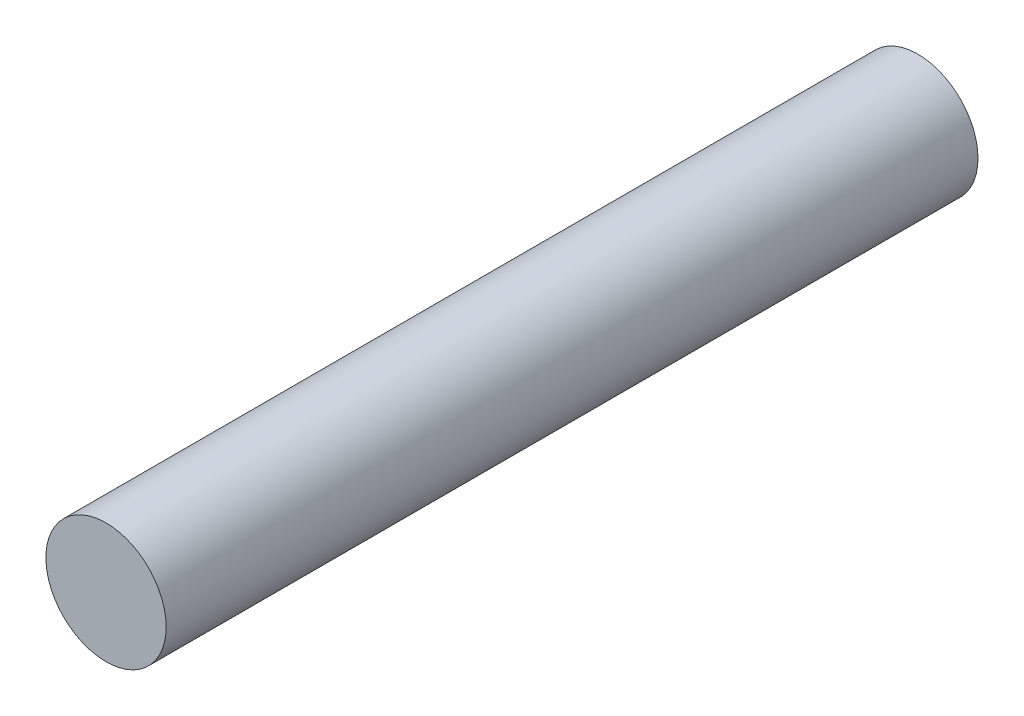
ISO-10303-21;
HEADER;
FILE_DESCRIPTION(('STEP AP214'),'2;1');
FILE_NAME('part.step','',(''),(''),'','','');
FILE_SCHEMA(('AUTOMOTIVE_DESIGN { 1 0 10303 214 1 1 1 1 }'));
ENDSEC;
DATA;
#1=APPLICATION_CONTEXT('core data for automotive mechanical design processes');
#2=APPLICATION_PROTOCOL_DEFINITION('international standard','automotive_design',2000,#1);
#3=PRODUCT_CONTEXT('',#1,'mechanical');
#4=PRODUCT('Part','Part','',(#3));
#5=PRODUCT_RELATED_PRODUCT_CATEGORY('part','',(#4));
#6=PRODUCT_DEFINITION_FORMATION('','',#4);
#7=PRODUCT_DEFINITION_CONTEXT('part definition',#1,'design');
#8=PRODUCT_DEFINITION('design','',#6,#7);
#9=PRODUCT_DEFINITION_SHAPE('','',#8);
#10=(LENGTH_UNIT() NAMED_UNIT(*) SI_UNIT(.MILLI.,.METRE.));
#11=(NAMED_UNIT(*) PLANE_ANGLE_UNIT() SI_UNIT($,.RADIAN.));
#12=(NAMED_UNIT(*) SI_UNIT($,.STERADIAN.) SOLID_ANGLE_UNIT());
#13=UNCERTAINTY_MEASURE_WITH_UNIT(LENGTH_MEASURE(1.E-05),#10,'distance_accuracy_value','');
#14=(GEOMETRIC_REPRESENTATION_CONTEXT(3) GLOBAL_UNCERTAINTY_ASSIGNED_CONTEXT((#13)) GLOBAL_UNIT_ASSIGNED_CONTEXT((#10,
#11,#12)) REPRESENTATION_CONTEXT('',''));
#15=CARTESIAN_POINT('',(0.,0.,0.));
#16=DIRECTION('',(0.,0.,1.));
#17=DIRECTION('',(1.,0.,0.));
#18=AXIS2_PLACEMENT_3D('',#15,#16,#17);
#19=CARTESIAN_POINT('',(0.,0.,27.));
#20=DIRECTION('',(0.,0.,-1.));
#21=DIRECTION('',(-1.,0.,0.));
#22=AXIS2_PLACEMENT_3D('',#19,#20,#21);
#23=CYLINDRICAL_SURFACE('',#22,2.);
#24=CARTESIAN_POINT('',(0.,0.,27.));
#25=DIRECTION('',(0.,0.,1.));
#26=DIRECTION('',(1.,0.,0.));
#27=AXIS2_PLACEMENT_3D('',#24,#25,#26);
#28=CIRCLE('',#27,2.);
#29=CARTESIAN_POINT('',(2.,0.,27.));
#30=VERTEX_POINT('',#29);
#31=EDGE_CURVE('E10',#30,#30,#28,.T.);
#32=ORIENTED_EDGE('',*,*,#31,.F.);
#33=EDGE_LOOP('',(#32));
#34=FACE_BOUND('',#33,.T.);
#35=CARTESIAN_POINT('',(0.,0.,0.));
#36=DIRECTION('',(0.,0.,1.));
#37=DIRECTION('',(1.,0.,0.));
#38=AXIS2_PLACEMENT_3D('',#35,#36,#37);
#39=CIRCLE('',#38,2.);
#40=CARTESIAN_POINT('',(2.,0.,0.));
#41=VERTEX_POINT('',#40);
#42=EDGE_CURVE('E40',#41,#41,#39,.T.);
#43=ORIENTED_EDGE('',*,*,#42,.T.);
#44=EDGE_LOOP('',(#43));
#45=FACE_BOUND('',#44,.T.);
#46=ADVANCED_FACE('F37',(#34,#45),#23,.T.);
#47=CARTESIAN_POINT('',(0.,0.,27.));
#48=DIRECTION('',(0.,0.,1.));
#49=DIRECTION('',(1.,0.,0.));
#50=AXIS2_PLACEMENT_3D('',#47,#48,#49);
#51=PLANE('',#50);
#52=ORIENTED_EDGE('',*,*,#31,.T.);
#53=EDGE_LOOP('',(#52));
#54=FACE_BOUND('',#53,.T.);
#55=ADVANCED_FACE('F54',(#54),#51,.T.);
#56=CARTESIAN_POINT('',(0.,0.,0.));
#57=DIRECTION('',(0.,0.,1.));
#58=DIRECTION('',(1.,0.,0.));
#59=AXIS2_PLACEMENT_3D('',#56,#57,#58);
#60=PLANE('',#59);
#61=ORIENTED_EDGE('',*,*,#42,.F.);
#62=EDGE_LOOP('',(#61));
#63=FACE_BOUND('',#62,.T.);
#64=ADVANCED_FACE('F52',(#63),#60,.F.);
#65=CLOSED_SHELL('',(#46,#55,#64));
#66=MANIFOLD_SOLID_BREP('B2',#65);
#67=ADVANCED_BREP_SHAPE_REPRESENTATION('',(#18,#66),#14);
#68=SHAPE_DEFINITION_REPRESENTATION(#9,#67);
ENDSEC;
END-ISO-10303-21;
